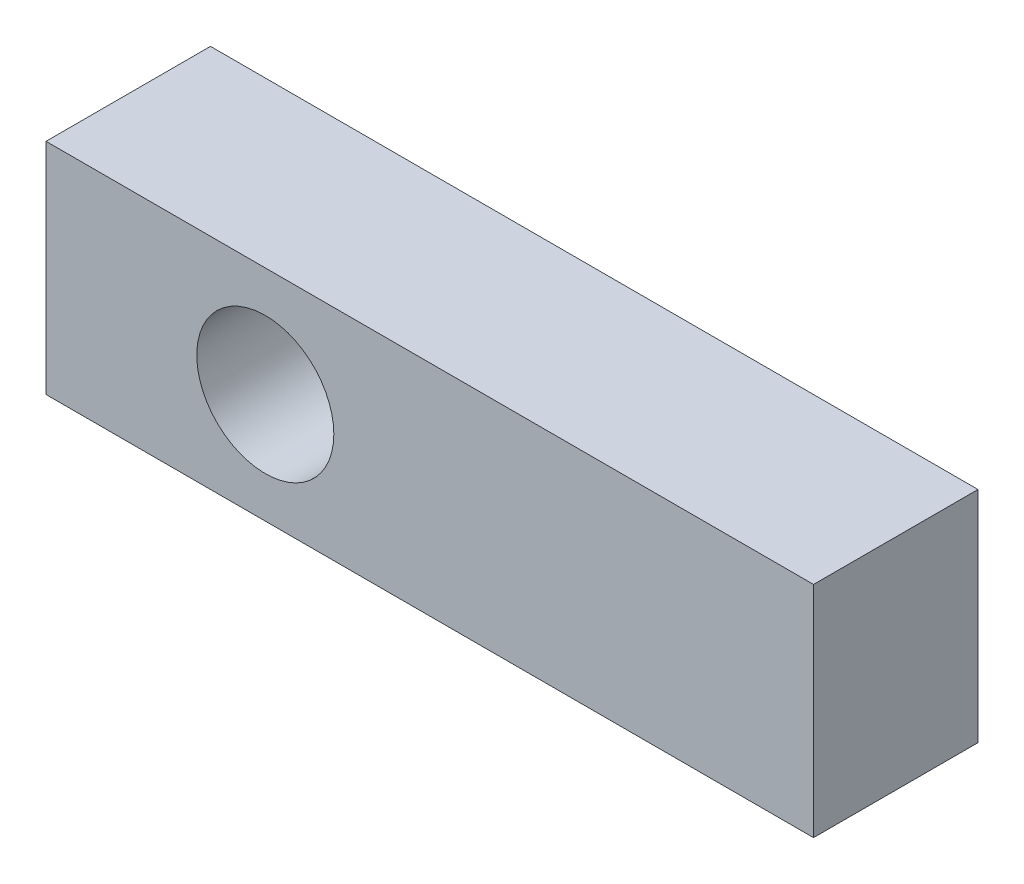
ISO-10303-21;
HEADER;
FILE_DESCRIPTION(('STEP AP214'),'2;1');
FILE_NAME('part.step','',(''),(''),'','','');
FILE_SCHEMA(('AUTOMOTIVE_DESIGN { 1 0 10303 214 1 1 1 1 }'));
ENDSEC;
DATA;
#1=APPLICATION_CONTEXT('core data for automotive mechanical design processes');
#2=APPLICATION_PROTOCOL_DEFINITION('international standard','automotive_design',2000,#1);
#3=PRODUCT_CONTEXT('',#1,'mechanical');
#4=PRODUCT('Part','Part','',(#3));
#5=PRODUCT_RELATED_PRODUCT_CATEGORY('part','',(#4));
#6=PRODUCT_DEFINITION_FORMATION('','',#4);
#7=PRODUCT_DEFINITION_CONTEXT('part definition',#1,'design');
#8=PRODUCT_DEFINITION('design','',#6,#7);
#9=PRODUCT_DEFINITION_SHAPE('','',#8);
#10=(LENGTH_UNIT() NAMED_UNIT(*) SI_UNIT(.MILLI.,.METRE.));
#11=(NAMED_UNIT(*) PLANE_ANGLE_UNIT() SI_UNIT($,.RADIAN.));
#12=(NAMED_UNIT(*) SI_UNIT($,.STERADIAN.) SOLID_ANGLE_UNIT());
#13=UNCERTAINTY_MEASURE_WITH_UNIT(LENGTH_MEASURE(1.E-05),#10,'distance_accuracy_value','');
#14=(GEOMETRIC_REPRESENTATION_CONTEXT(3) GLOBAL_UNCERTAINTY_ASSIGNED_CONTEXT((#13)) GLOBAL_UNIT_ASSIGNED_CONTEXT((#10,
#11,#12)) REPRESENTATION_CONTEXT('',''));
#15=CARTESIAN_POINT('',(0.,0.,0.));
#16=DIRECTION('',(0.,0.,1.));
#17=DIRECTION('',(1.,0.,0.));
#18=AXIS2_PLACEMENT_3D('',#15,#16,#17);
#19=CARTESIAN_POINT('',(14.,4.,6.));
#20=DIRECTION('',(-1.,0.,0.));
#21=DIRECTION('',(0.,-1.,0.));
#22=AXIS2_PLACEMENT_3D('',#19,#20,#21);
#23=PLANE('',#22);
#24=DIRECTION('',(0.,1.,0.));
#25=VECTOR('',#24,1.);
#26=CARTESIAN_POINT('',(14.,4.,0.));
#27=LINE('',#26,#25);
#28=CARTESIAN_POINT('',(14.,-4.,0.));
#29=VERTEX_POINT('',#28);
#30=CARTESIAN_POINT('',(14.,4.,0.));
#31=VERTEX_POINT('',#30);
#32=EDGE_CURVE('E114',#29,#31,#27,.T.);
#33=ORIENTED_EDGE('',*,*,#32,.T.);
#34=DIRECTION('',(0.,0.,-1.));
#35=VECTOR('',#34,1.);
#36=CARTESIAN_POINT('',(14.,4.,6.));
#37=LINE('',#36,#35);
#38=CARTESIAN_POINT('',(14.,4.,6.));
#39=VERTEX_POINT('',#38);
#40=EDGE_CURVE('E11',#39,#31,#37,.T.);
#41=ORIENTED_EDGE('',*,*,#40,.F.);
#42=DIRECTION('',(0.,1.,0.));
#43=VECTOR('',#42,1.);
#44=CARTESIAN_POINT('',(14.,4.,6.));
#45=LINE('',#44,#43);
#46=CARTESIAN_POINT('',(14.,-4.,6.));
#47=VERTEX_POINT('',#46);
#48=EDGE_CURVE('E100',#47,#39,#45,.T.);
#49=ORIENTED_EDGE('',*,*,#48,.F.);
#50=DIRECTION('',(0.,0.,-1.));
#51=VECTOR('',#50,1.);
#52=CARTESIAN_POINT('',(14.,-4.,6.));
#53=LINE('',#52,#51);
#54=EDGE_CURVE('E108',#47,#29,#53,.T.);
#55=ORIENTED_EDGE('',*,*,#54,.T.);
#56=EDGE_LOOP('',(#33,#41,#49,#55));
#57=FACE_BOUND('',#56,.T.);
#58=ADVANCED_FACE('F44',(#57),#23,.F.);
#59=CARTESIAN_POINT('',(-14.,4.,6.));
#60=DIRECTION('',(0.,-1.,0.));
#61=DIRECTION('',(0.,0.,-1.));
#62=AXIS2_PLACEMENT_3D('',#59,#60,#61);
#63=PLANE('',#62);
#64=DIRECTION('',(-1.,0.,0.));
#65=VECTOR('',#64,1.);
#66=CARTESIAN_POINT('',(-14.,4.,0.));
#67=LINE('',#66,#65);
#68=CARTESIAN_POINT('',(-14.,4.,0.));
#69=VERTEX_POINT('',#68);
#70=EDGE_CURVE('E105',#31,#69,#67,.T.);
#71=ORIENTED_EDGE('',*,*,#70,.T.);
#72=DIRECTION('',(0.,0.,-1.));
#73=VECTOR('',#72,1.);
#74=CARTESIAN_POINT('',(-14.,4.,6.));
#75=LINE('',#74,#73);
#76=CARTESIAN_POINT('',(-14.,4.,6.));
#77=VERTEX_POINT('',#76);
#78=EDGE_CURVE('E53',#77,#69,#75,.T.);
#79=ORIENTED_EDGE('',*,*,#78,.F.);
#80=DIRECTION('',(-1.,0.,0.));
#81=VECTOR('',#80,1.);
#82=CARTESIAN_POINT('',(-14.,4.,6.));
#83=LINE('',#82,#81);
#84=EDGE_CURVE('E95',#39,#77,#83,.T.);
#85=ORIENTED_EDGE('',*,*,#84,.F.);
#86=ORIENTED_EDGE('',*,*,#40,.T.);
#87=EDGE_LOOP('',(#71,#79,#85,#86));
#88=FACE_BOUND('',#87,.T.);
#89=ADVANCED_FACE('F101',(#88),#63,.F.);
#90=CARTESIAN_POINT('',(-14.,4.,6.));
#91=DIRECTION('',(1.,0.,0.));
#92=DIRECTION('',(0.,0.,-1.));
#93=AXIS2_PLACEMENT_3D('',#90,#91,#92);
#94=PLANE('',#93);
#95=DIRECTION('',(0.,-1.,0.));
#96=VECTOR('',#95,1.);
#97=CARTESIAN_POINT('',(-14.,4.,0.));
#98=LINE('',#97,#96);
#99=CARTESIAN_POINT('',(-14.,-4.,0.));
#100=VERTEX_POINT('',#99);
#101=EDGE_CURVE('E76',#69,#100,#98,.T.);
#102=ORIENTED_EDGE('',*,*,#101,.T.);
#103=DIRECTION('',(0.,0.,-1.));
#104=VECTOR('',#103,1.);
#105=CARTESIAN_POINT('',(-14.,-4.,6.));
#106=LINE('',#105,#104);
#107=CARTESIAN_POINT('',(-14.,-4.,6.));
#108=VERTEX_POINT('',#107);
#109=EDGE_CURVE('E102',#108,#100,#106,.T.);
#110=ORIENTED_EDGE('',*,*,#109,.F.);
#111=DIRECTION('',(0.,-1.,0.));
#112=VECTOR('',#111,1.);
#113=CARTESIAN_POINT('',(-14.,4.,6.));
#114=LINE('',#113,#112);
#115=EDGE_CURVE('E92',#77,#108,#114,.T.);
#116=ORIENTED_EDGE('',*,*,#115,.F.);
#117=ORIENTED_EDGE('',*,*,#78,.T.);
#118=EDGE_LOOP('',(#102,#110,#116,#117));
#119=FACE_BOUND('',#118,.T.);
#120=ADVANCED_FACE('F104',(#119),#94,.F.);
#121=CARTESIAN_POINT('',(-14.,-4.,6.));
#122=DIRECTION('',(0.,1.,0.));
#123=DIRECTION('',(0.,0.,1.));
#124=AXIS2_PLACEMENT_3D('',#121,#122,#123);
#125=PLANE('',#124);
#126=DIRECTION('',(1.,0.,0.));
#127=VECTOR('',#126,1.);
#128=CARTESIAN_POINT('',(-14.,-4.,0.));
#129=LINE('',#128,#127);
#130=EDGE_CURVE('E84',#100,#29,#129,.T.);
#131=ORIENTED_EDGE('',*,*,#130,.T.);
#132=ORIENTED_EDGE('',*,*,#54,.F.);
#133=DIRECTION('',(1.,0.,0.));
#134=VECTOR('',#133,1.);
#135=CARTESIAN_POINT('',(-14.,-4.,6.));
#136=LINE('',#135,#134);
#137=EDGE_CURVE('E65',#108,#47,#136,.T.);
#138=ORIENTED_EDGE('',*,*,#137,.F.);
#139=ORIENTED_EDGE('',*,*,#109,.T.);
#140=EDGE_LOOP('',(#131,#132,#138,#139));
#141=FACE_BOUND('',#140,.T.);
#142=ADVANCED_FACE('F130',(#141),#125,.F.);
#143=CARTESIAN_POINT('',(0.,0.,6.));
#144=DIRECTION('',(0.,0.,1.));
#145=DIRECTION('',(1.,0.,0.));
#146=AXIS2_PLACEMENT_3D('',#143,#144,#145);
#147=PLANE('',#146);
#148=CARTESIAN_POINT('',(-5.99999999999999,0.,6.));
#149=DIRECTION('',(0.,0.,1.));
#150=DIRECTION('',(1.,0.,0.));
#151=AXIS2_PLACEMENT_3D('',#148,#149,#150);
#152=CIRCLE('',#151,2.5);
#153=CARTESIAN_POINT('',(-3.49999999999999,0.,6.));
#154=VERTEX_POINT('',#153);
#155=EDGE_CURVE('E131',#154,#154,#152,.T.);
#156=ORIENTED_EDGE('',*,*,#155,.F.);
#157=EDGE_LOOP('',(#156));
#158=FACE_BOUND('',#157,.T.);
#159=ORIENTED_EDGE('',*,*,#48,.T.);
#160=ORIENTED_EDGE('',*,*,#84,.T.);
#161=ORIENTED_EDGE('',*,*,#115,.T.);
#162=ORIENTED_EDGE('',*,*,#137,.T.);
#163=EDGE_LOOP('',(#159,#160,#161,#162));
#164=FACE_BOUND('',#163,.T.);
#165=ADVANCED_FACE('F91',(#158,#164),#147,.T.);
#166=CARTESIAN_POINT('',(0.,0.,0.));
#167=DIRECTION('',(0.,0.,1.));
#168=DIRECTION('',(1.,0.,0.));
#169=AXIS2_PLACEMENT_3D('',#166,#167,#168);
#170=PLANE('',#169);
#171=CARTESIAN_POINT('',(-5.99999999999999,0.,0.));
#172=DIRECTION('',(0.,0.,1.));
#173=DIRECTION('',(1.,0.,0.));
#174=AXIS2_PLACEMENT_3D('',#171,#172,#173);
#175=CIRCLE('',#174,2.5);
#176=CARTESIAN_POINT('',(-3.49999999999999,0.,0.));
#177=VERTEX_POINT('',#176);
#178=EDGE_CURVE('E120',#177,#177,#175,.T.);
#179=ORIENTED_EDGE('',*,*,#178,.T.);
#180=EDGE_LOOP('',(#179));
#181=FACE_BOUND('',#180,.T.);
#182=ORIENTED_EDGE('',*,*,#32,.F.);
#183=ORIENTED_EDGE('',*,*,#130,.F.);
#184=ORIENTED_EDGE('',*,*,#101,.F.);
#185=ORIENTED_EDGE('',*,*,#70,.F.);
#186=EDGE_LOOP('',(#182,#183,#184,#185));
#187=FACE_BOUND('',#186,.T.);
#188=ADVANCED_FACE('F128',(#181,#187),#170,.F.);
#189=CARTESIAN_POINT('',(-5.99999999999999,0.,0.));
#190=DIRECTION('',(0.,0.,1.));
#191=DIRECTION('',(1.,0.,0.));
#192=AXIS2_PLACEMENT_3D('',#189,#190,#191);
#193=CYLINDRICAL_SURFACE('',#192,2.5);
#194=ORIENTED_EDGE('',*,*,#178,.F.);
#195=EDGE_LOOP('',(#194));
#196=FACE_BOUND('',#195,.T.);
#197=ORIENTED_EDGE('',*,*,#155,.T.);
#198=EDGE_LOOP('',(#197));
#199=FACE_BOUND('',#198,.T.);
#200=ADVANCED_FACE('F141',(#196,#199),#193,.F.);
#201=CLOSED_SHELL('',(#58,#89,#120,#142,#165,#188,#200));
#202=MANIFOLD_SOLID_BREP('B2',#201);
#203=ADVANCED_BREP_SHAPE_REPRESENTATION('',(#18,#202),#14);
#204=SHAPE_DEFINITION_REPRESENTATION(#9,#203);
ENDSEC;
END-ISO-10303-21;
